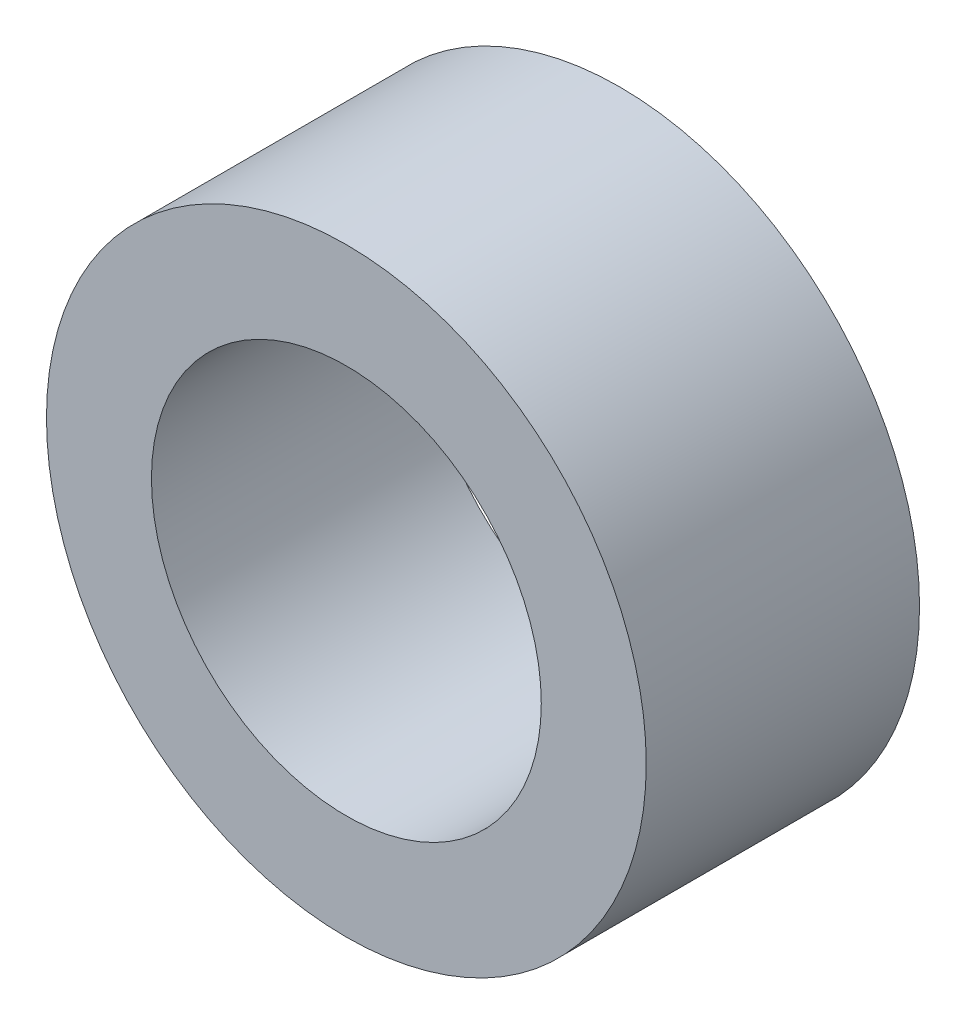
ISO-10303-21;
HEADER;
FILE_DESCRIPTION(('STEP AP214'),'2;1');
FILE_NAME('part.step','',(''),(''),'','','');
FILE_SCHEMA(('AUTOMOTIVE_DESIGN { 1 0 10303 214 1 1 1 1 }'));
ENDSEC;
DATA;
#1=APPLICATION_CONTEXT('core data for automotive mechanical design processes');
#2=APPLICATION_PROTOCOL_DEFINITION('international standard','automotive_design',2000,#1);
#3=PRODUCT_CONTEXT('',#1,'mechanical');
#4=PRODUCT('Part','Part','',(#3));
#5=PRODUCT_RELATED_PRODUCT_CATEGORY('part','',(#4));
#6=PRODUCT_DEFINITION_FORMATION('','',#4);
#7=PRODUCT_DEFINITION_CONTEXT('part definition',#1,'design');
#8=PRODUCT_DEFINITION('design','',#6,#7);
#9=PRODUCT_DEFINITION_SHAPE('','',#8);
#10=(LENGTH_UNIT() NAMED_UNIT(*) SI_UNIT(.MILLI.,.METRE.));
#11=(NAMED_UNIT(*) PLANE_ANGLE_UNIT() SI_UNIT($,.RADIAN.));
#12=(NAMED_UNIT(*) SI_UNIT($,.STERADIAN.) SOLID_ANGLE_UNIT());
#13=UNCERTAINTY_MEASURE_WITH_UNIT(LENGTH_MEASURE(1.E-05),#10,'distance_accuracy_value','');
#14=(GEOMETRIC_REPRESENTATION_CONTEXT(3) GLOBAL_UNCERTAINTY_ASSIGNED_CONTEXT((#13)) GLOBAL_UNIT_ASSIGNED_CONTEXT((#10,
#11,#12)) REPRESENTATION_CONTEXT('',''));
#15=CARTESIAN_POINT('',(0.,0.,0.));
#16=DIRECTION('',(0.,0.,1.));
#17=DIRECTION('',(1.,0.,0.));
#18=AXIS2_PLACEMENT_3D('',#15,#16,#17);
#19=CARTESIAN_POINT('',(0.,0.,2.27825));
#20=DIRECTION('',(0.,0.,1.));
#21=DIRECTION('',(1.,0.,0.));
#22=AXIS2_PLACEMENT_3D('',#19,#20,#21);
#23=PLANE('',#22);
#24=CARTESIAN_POINT('',(0.,0.,2.27825));
#25=DIRECTION('',(0.,0.,1.));
#26=DIRECTION('',(1.,0.,0.));
#27=AXIS2_PLACEMENT_3D('',#24,#25,#26);
#28=CIRCLE('',#27,5.);
#29=CARTESIAN_POINT('',(5.,0.,2.27825));
#30=VERTEX_POINT('',#29);
#31=EDGE_CURVE('E10',#30,#30,#28,.T.);
#32=ORIENTED_EDGE('',*,*,#31,.T.);
#33=EDGE_LOOP('',(#32));
#34=FACE_BOUND('',#33,.T.);
#35=CARTESIAN_POINT('',(0.,0.,2.27825));
#36=DIRECTION('',(0.,0.,1.));
#37=DIRECTION('',(1.,0.,0.));
#38=AXIS2_PLACEMENT_3D('',#35,#36,#37);
#39=CIRCLE('',#38,3.25);
#40=CARTESIAN_POINT('',(3.25,0.,2.27825));
#41=VERTEX_POINT('',#40);
#42=EDGE_CURVE('E49',#41,#41,#39,.T.);
#43=ORIENTED_EDGE('',*,*,#42,.F.);
#44=EDGE_LOOP('',(#43));
#45=FACE_BOUND('',#44,.T.);
#46=ADVANCED_FACE('F39',(#34,#45),#23,.T.);
#47=CARTESIAN_POINT('',(0.,0.,-2.27825));
#48=DIRECTION('',(0.,0.,1.));
#49=DIRECTION('',(1.,0.,0.));
#50=AXIS2_PLACEMENT_3D('',#47,#48,#49);
#51=PLANE('',#50);
#52=CARTESIAN_POINT('',(0.,0.,-2.27825));
#53=DIRECTION('',(0.,0.,1.));
#54=DIRECTION('',(1.,0.,0.));
#55=AXIS2_PLACEMENT_3D('',#52,#53,#54);
#56=CIRCLE('',#55,5.);
#57=CARTESIAN_POINT('',(5.,0.,-2.27825));
#58=VERTEX_POINT('',#57);
#59=EDGE_CURVE('E43',#58,#58,#56,.T.);
#60=ORIENTED_EDGE('',*,*,#59,.F.);
#61=EDGE_LOOP('',(#60));
#62=FACE_BOUND('',#61,.T.);
#63=CARTESIAN_POINT('',(0.,0.,-2.27825));
#64=DIRECTION('',(0.,0.,1.));
#65=DIRECTION('',(1.,0.,0.));
#66=AXIS2_PLACEMENT_3D('',#63,#64,#65);
#67=CIRCLE('',#66,3.25);
#68=CARTESIAN_POINT('',(3.25,0.,-2.27825));
#69=VERTEX_POINT('',#68);
#70=EDGE_CURVE('E55',#69,#69,#67,.T.);
#71=ORIENTED_EDGE('',*,*,#70,.T.);
#72=EDGE_LOOP('',(#71));
#73=FACE_BOUND('',#72,.T.);
#74=ADVANCED_FACE('F65',(#62,#73),#51,.F.);
#75=CARTESIAN_POINT('',(0.,0.,2.27825));
#76=DIRECTION('',(0.,0.,-1.));
#77=DIRECTION('',(-1.,0.,0.));
#78=AXIS2_PLACEMENT_3D('',#75,#76,#77);
#79=CYLINDRICAL_SURFACE('',#78,5.);
#80=ORIENTED_EDGE('',*,*,#31,.F.);
#81=EDGE_LOOP('',(#80));
#82=FACE_BOUND('',#81,.T.);
#83=ORIENTED_EDGE('',*,*,#59,.T.);
#84=EDGE_LOOP('',(#83));
#85=FACE_BOUND('',#84,.T.);
#86=ADVANCED_FACE('F41',(#82,#85),#79,.T.);
#87=CARTESIAN_POINT('',(0.,0.,2.27825));
#88=DIRECTION('',(0.,0.,-1.));
#89=DIRECTION('',(-1.,0.,0.));
#90=AXIS2_PLACEMENT_3D('',#87,#88,#89);
#91=CYLINDRICAL_SURFACE('',#90,3.25);
#92=ORIENTED_EDGE('',*,*,#42,.T.);
#93=EDGE_LOOP('',(#92));
#94=FACE_BOUND('',#93,.T.);
#95=ORIENTED_EDGE('',*,*,#70,.F.);
#96=EDGE_LOOP('',(#95));
#97=FACE_BOUND('',#96,.T.);
#98=ADVANCED_FACE('F59',(#94,#97),#91,.F.);
#99=CLOSED_SHELL('',(#46,#74,#86,#98));
#100=MANIFOLD_SOLID_BREP('B2',#99);
#101=ADVANCED_BREP_SHAPE_REPRESENTATION('',(#18,#100),#14);
#102=SHAPE_DEFINITION_REPRESENTATION(#9,#101);
ENDSEC;
END-ISO-10303-21;
